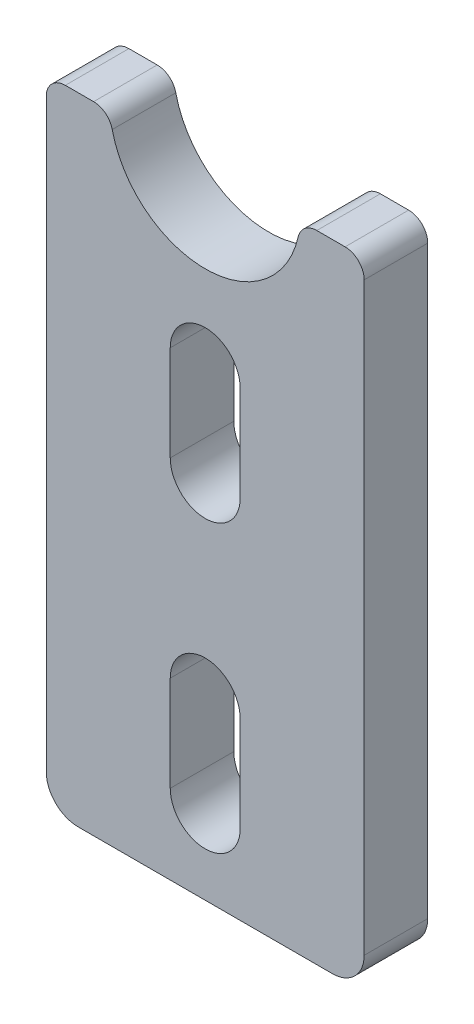
ISO-10303-21;
HEADER;
FILE_DESCRIPTION(('STEP AP214'),'2;1');
FILE_NAME('part.step','',(''),(''),'','','');
FILE_SCHEMA(('AUTOMOTIVE_DESIGN { 1 0 10303 214 1 1 1 1 }'));
ENDSEC;
DATA;
#1=APPLICATION_CONTEXT('core data for automotive mechanical design processes');
#2=APPLICATION_PROTOCOL_DEFINITION('international standard','automotive_design',2000,#1);
#3=PRODUCT_CONTEXT('',#1,'mechanical');
#4=PRODUCT('Part','Part','',(#3));
#5=PRODUCT_RELATED_PRODUCT_CATEGORY('part','',(#4));
#6=PRODUCT_DEFINITION_FORMATION('','',#4);
#7=PRODUCT_DEFINITION_CONTEXT('part definition',#1,'design');
#8=PRODUCT_DEFINITION('design','',#6,#7);
#9=PRODUCT_DEFINITION_SHAPE('','',#8);
#10=(LENGTH_UNIT() NAMED_UNIT(*) SI_UNIT(.MILLI.,.METRE.));
#11=(NAMED_UNIT(*) PLANE_ANGLE_UNIT() SI_UNIT($,.RADIAN.));
#12=(NAMED_UNIT(*) SI_UNIT($,.STERADIAN.) SOLID_ANGLE_UNIT());
#13=UNCERTAINTY_MEASURE_WITH_UNIT(LENGTH_MEASURE(1.E-05),#10,'distance_accuracy_value','');
#14=(GEOMETRIC_REPRESENTATION_CONTEXT(3) GLOBAL_UNCERTAINTY_ASSIGNED_CONTEXT((#13)) GLOBAL_UNIT_ASSIGNED_CONTEXT((#10,
#11,#12)) REPRESENTATION_CONTEXT('',''));
#15=CARTESIAN_POINT('',(0.,0.,0.));
#16=DIRECTION('',(0.,0.,1.));
#17=DIRECTION('',(1.,0.,0.));
#18=AXIS2_PLACEMENT_3D('',#15,#16,#17);
#19=CARTESIAN_POINT('',(-25.,50.,-10.));
#20=DIRECTION('',(0.,1.,0.));
#21=DIRECTION('',(0.,0.,1.));
#22=AXIS2_PLACEMENT_3D('',#19,#20,#21);
#23=PLANE('',#22);
#24=DIRECTION('',(-1.,0.,0.));
#25=VECTOR('',#24,1.);
#26=CARTESIAN_POINT('',(-25.,50.,0.));
#27=LINE('',#26,#25);
#28=CARTESIAN_POINT('',(-17.5499287747842,50.,0.));
#29=VERTEX_POINT('',#28);
#30=CARTESIAN_POINT('',(-22.,50.,0.));
#31=VERTEX_POINT('',#30);
#32=EDGE_CURVE('E269',#29,#31,#27,.T.);
#33=ORIENTED_EDGE('',*,*,#32,.F.);
#34=DIRECTION('',(0.,0.,-1.));
#35=VECTOR('',#34,1.);
#36=CARTESIAN_POINT('',(-17.5499287747842,50.,-10.));
#37=LINE('',#36,#35);
#38=CARTESIAN_POINT('',(-17.5499287747842,50.,-10.));
#39=VERTEX_POINT('',#38);
#40=EDGE_CURVE('E46',#29,#39,#37,.T.);
#41=ORIENTED_EDGE('',*,*,#40,.T.);
#42=DIRECTION('',(-1.,0.,0.));
#43=VECTOR('',#42,1.);
#44=CARTESIAN_POINT('',(-25.,50.,-10.));
#45=LINE('',#44,#43);
#46=CARTESIAN_POINT('',(-22.,50.,-10.));
#47=VERTEX_POINT('',#46);
#48=EDGE_CURVE('E256',#39,#47,#45,.T.);
#49=ORIENTED_EDGE('',*,*,#48,.T.);
#50=DIRECTION('',(0.,0.,1.));
#51=VECTOR('',#50,1.);
#52=CARTESIAN_POINT('',(-22.,50.,-10.));
#53=LINE('',#52,#51);
#54=EDGE_CURVE('E322',#47,#31,#53,.T.);
#55=ORIENTED_EDGE('',*,*,#54,.T.);
#56=EDGE_LOOP('',(#33,#41,#49,#55));
#57=FACE_BOUND('',#56,.T.);
#58=ADVANCED_FACE('F38',(#57),#23,.T.);
#59=CARTESIAN_POINT('',(25.,50.,-10.));
#60=DIRECTION('',(1.,0.,0.));
#61=DIRECTION('',(0.,1.,0.));
#62=AXIS2_PLACEMENT_3D('',#59,#60,#61);
#63=PLANE('',#62);
#64=DIRECTION('',(0.,1.,0.));
#65=VECTOR('',#64,1.);
#66=CARTESIAN_POINT('',(25.,50.,-10.));
#67=LINE('',#66,#65);
#68=CARTESIAN_POINT('',(25.,-45.,-10.));
#69=VERTEX_POINT('',#68);
#70=CARTESIAN_POINT('',(25.,47.,-10.));
#71=VERTEX_POINT('',#70);
#72=EDGE_CURVE('E253',#69,#71,#67,.T.);
#73=ORIENTED_EDGE('',*,*,#72,.T.);
#74=DIRECTION('',(0.,0.,1.));
#75=VECTOR('',#74,1.);
#76=CARTESIAN_POINT('',(25.,47.,-10.));
#77=LINE('',#76,#75);
#78=CARTESIAN_POINT('',(25.,47.,0.));
#79=VERTEX_POINT('',#78);
#80=EDGE_CURVE('E295',#71,#79,#77,.T.);
#81=ORIENTED_EDGE('',*,*,#80,.T.);
#82=DIRECTION('',(0.,1.,0.));
#83=VECTOR('',#82,1.);
#84=CARTESIAN_POINT('',(25.,50.,0.));
#85=LINE('',#84,#83);
#86=CARTESIAN_POINT('',(25.,-45.,0.));
#87=VERTEX_POINT('',#86);
#88=EDGE_CURVE('E252',#87,#79,#85,.T.);
#89=ORIENTED_EDGE('',*,*,#88,.F.);
#90=DIRECTION('',(0.,0.,1.));
#91=VECTOR('',#90,1.);
#92=CARTESIAN_POINT('',(25.,-45.,-10.));
#93=LINE('',#92,#91);
#94=EDGE_CURVE('E285',#87,#69,#93,.F.);
#95=ORIENTED_EDGE('',*,*,#94,.T.);
#96=EDGE_LOOP('',(#73,#81,#89,#95));
#97=FACE_BOUND('',#96,.T.);
#98=ADVANCED_FACE('F385',(#97),#63,.T.);
#99=CARTESIAN_POINT('',(-25.,-50.,-10.));
#100=DIRECTION('',(0.,-1.,0.));
#101=DIRECTION('',(0.,0.,-1.));
#102=AXIS2_PLACEMENT_3D('',#99,#100,#101);
#103=PLANE('',#102);
#104=DIRECTION('',(1.,0.,0.));
#105=VECTOR('',#104,1.);
#106=CARTESIAN_POINT('',(-25.,-50.,-10.));
#107=LINE('',#106,#105);
#108=CARTESIAN_POINT('',(-20.,-50.,-10.));
#109=VERTEX_POINT('',#108);
#110=CARTESIAN_POINT('',(20.,-50.,-10.));
#111=VERTEX_POINT('',#110);
#112=EDGE_CURVE('E263',#109,#111,#107,.T.);
#113=ORIENTED_EDGE('',*,*,#112,.T.);
#114=DIRECTION('',(0.,0.,1.));
#115=VECTOR('',#114,1.);
#116=CARTESIAN_POINT('',(20.,-50.,-10.));
#117=LINE('',#116,#115);
#118=CARTESIAN_POINT('',(20.,-50.,0.));
#119=VERTEX_POINT('',#118);
#120=EDGE_CURVE('E278',#111,#119,#117,.T.);
#121=ORIENTED_EDGE('',*,*,#120,.T.);
#122=DIRECTION('',(1.,0.,0.));
#123=VECTOR('',#122,1.);
#124=CARTESIAN_POINT('',(-25.,-50.,0.));
#125=LINE('',#124,#123);
#126=CARTESIAN_POINT('',(-20.,-50.,0.));
#127=VERTEX_POINT('',#126);
#128=EDGE_CURVE('E257',#127,#119,#125,.T.);
#129=ORIENTED_EDGE('',*,*,#128,.F.);
#130=DIRECTION('',(0.,0.,1.));
#131=VECTOR('',#130,1.);
#132=CARTESIAN_POINT('',(-20.,-50.,-10.));
#133=LINE('',#132,#131);
#134=EDGE_CURVE('E266',#127,#109,#133,.F.);
#135=ORIENTED_EDGE('',*,*,#134,.T.);
#136=EDGE_LOOP('',(#113,#121,#129,#135));
#137=FACE_BOUND('',#136,.T.);
#138=ADVANCED_FACE('F390',(#137),#103,.T.);
#139=CARTESIAN_POINT('',(-25.,50.,-10.));
#140=DIRECTION('',(-1.,0.,0.));
#141=DIRECTION('',(0.,-1.,0.));
#142=AXIS2_PLACEMENT_3D('',#139,#140,#141);
#143=PLANE('',#142);
#144=DIRECTION('',(0.,-1.,0.));
#145=VECTOR('',#144,1.);
#146=CARTESIAN_POINT('',(-25.,50.,0.));
#147=LINE('',#146,#145);
#148=CARTESIAN_POINT('',(-25.,47.,0.));
#149=VERTEX_POINT('',#148);
#150=CARTESIAN_POINT('',(-25.,-45.,0.));
#151=VERTEX_POINT('',#150);
#152=EDGE_CURVE('E273',#149,#151,#147,.T.);
#153=ORIENTED_EDGE('',*,*,#152,.F.);
#154=DIRECTION('',(0.,0.,1.));
#155=VECTOR('',#154,1.);
#156=CARTESIAN_POINT('',(-25.,47.,-10.));
#157=LINE('',#156,#155);
#158=CARTESIAN_POINT('',(-25.,47.,-10.));
#159=VERTEX_POINT('',#158);
#160=EDGE_CURVE('E11',#149,#159,#157,.F.);
#161=ORIENTED_EDGE('',*,*,#160,.T.);
#162=DIRECTION('',(0.,-1.,0.));
#163=VECTOR('',#162,1.);
#164=CARTESIAN_POINT('',(-25.,50.,-10.));
#165=LINE('',#164,#163);
#166=CARTESIAN_POINT('',(-25.,-45.,-10.));
#167=VERTEX_POINT('',#166);
#168=EDGE_CURVE('E261',#159,#167,#165,.T.);
#169=ORIENTED_EDGE('',*,*,#168,.T.);
#170=DIRECTION('',(0.,0.,1.));
#171=VECTOR('',#170,1.);
#172=CARTESIAN_POINT('',(-25.,-45.,-10.));
#173=LINE('',#172,#171);
#174=EDGE_CURVE('E292',#167,#151,#173,.T.);
#175=ORIENTED_EDGE('',*,*,#174,.T.);
#176=EDGE_LOOP('',(#153,#161,#169,#175));
#177=FACE_BOUND('',#176,.T.);
#178=ADVANCED_FACE('F395',(#177),#143,.T.);
#179=CARTESIAN_POINT('',(22.,50.,0.));
#180=VERTEX_POINT('',#179);
#181=CARTESIAN_POINT('',(17.5499287747842,50.,0.));
#182=VERTEX_POINT('',#181);
#183=EDGE_CURVE('E270',#180,#182,#27,.T.);
#184=ORIENTED_EDGE('',*,*,#183,.F.);
#185=DIRECTION('',(0.,0.,1.));
#186=VECTOR('',#185,1.);
#187=CARTESIAN_POINT('',(22.,50.,-10.));
#188=LINE('',#187,#186);
#189=CARTESIAN_POINT('',(22.,50.,-10.));
#190=VERTEX_POINT('',#189);
#191=EDGE_CURVE('E308',#180,#190,#188,.F.);
#192=ORIENTED_EDGE('',*,*,#191,.T.);
#193=CARTESIAN_POINT('',(17.5499287747842,50.,-10.));
#194=VERTEX_POINT('',#193);
#195=EDGE_CURVE('E260',#190,#194,#45,.T.);
#196=ORIENTED_EDGE('',*,*,#195,.T.);
#197=DIRECTION('',(0.,0.,-1.));
#198=VECTOR('',#197,1.);
#199=CARTESIAN_POINT('',(17.5499287747842,50.,0.));
#200=LINE('',#199,#198);
#201=EDGE_CURVE('E306',#194,#182,#200,.F.);
#202=ORIENTED_EDGE('',*,*,#201,.T.);
#203=EDGE_LOOP('',(#184,#192,#196,#202));
#204=FACE_BOUND('',#203,.T.);
#205=ADVANCED_FACE('F357',(#204),#23,.T.);
#206=CARTESIAN_POINT('',(0.,0.,-10.));
#207=DIRECTION('',(0.,0.,1.));
#208=DIRECTION('',(1.,0.,0.));
#209=AXIS2_PLACEMENT_3D('',#206,#207,#208);
#210=PLANE('',#209);
#211=DIRECTION('',(0.,1.,0.));
#212=VECTOR('',#211,1.);
#213=CARTESIAN_POINT('',(5.5,0.,-10.));
#214=LINE('',#213,#212);
#215=CARTESIAN_POINT('',(5.5,7.5,-10.));
#216=VERTEX_POINT('',#215);
#217=CARTESIAN_POINT('',(5.5,22.5,-10.));
#218=VERTEX_POINT('',#217);
#219=EDGE_CURVE('E246',#216,#218,#214,.T.);
#220=ORIENTED_EDGE('',*,*,#219,.T.);
#221=CARTESIAN_POINT('',(0.,22.5,-10.));
#222=DIRECTION('',(0.,0.,1.));
#223=DIRECTION('',(1.,0.,0.));
#224=AXIS2_PLACEMENT_3D('',#221,#222,#223);
#225=CIRCLE('',#224,5.5);
#226=CARTESIAN_POINT('',(-5.5,22.5,-10.));
#227=VERTEX_POINT('',#226);
#228=EDGE_CURVE('E249',#218,#227,#225,.T.);
#229=ORIENTED_EDGE('',*,*,#228,.T.);
#230=DIRECTION('',(0.,-1.,0.));
#231=VECTOR('',#230,1.);
#232=CARTESIAN_POINT('',(-5.49999999999999,0.,-10.));
#233=LINE('',#232,#231);
#234=CARTESIAN_POINT('',(-5.49999999999999,7.5,-10.));
#235=VERTEX_POINT('',#234);
#236=EDGE_CURVE('E243',#227,#235,#233,.T.);
#237=ORIENTED_EDGE('',*,*,#236,.T.);
#238=CARTESIAN_POINT('',(0.,7.5,-10.));
#239=DIRECTION('',(0.,0.,1.));
#240=DIRECTION('',(1.,0.,0.));
#241=AXIS2_PLACEMENT_3D('',#238,#239,#240);
#242=CIRCLE('',#241,5.5);
#243=EDGE_CURVE('E183',#235,#216,#242,.T.);
#244=ORIENTED_EDGE('',*,*,#243,.T.);
#245=EDGE_LOOP('',(#220,#229,#237,#244));
#246=FACE_BOUND('',#245,.T.);
#247=DIRECTION('',(0.,-1.,0.));
#248=VECTOR('',#247,1.);
#249=CARTESIAN_POINT('',(-5.50000000000001,0.,-10.));
#250=LINE('',#249,#248);
#251=CARTESIAN_POINT('',(-5.5,-22.5,-10.));
#252=VERTEX_POINT('',#251);
#253=CARTESIAN_POINT('',(-5.5,-37.5,-10.));
#254=VERTEX_POINT('',#253);
#255=EDGE_CURVE('E237',#252,#254,#250,.T.);
#256=ORIENTED_EDGE('',*,*,#255,.T.);
#257=CARTESIAN_POINT('',(0.,-37.5,-10.));
#258=DIRECTION('',(0.,0.,1.));
#259=DIRECTION('',(1.,0.,0.));
#260=AXIS2_PLACEMENT_3D('',#257,#258,#259);
#261=CIRCLE('',#260,5.5);
#262=CARTESIAN_POINT('',(5.5,-37.5,-10.));
#263=VERTEX_POINT('',#262);
#264=EDGE_CURVE('E240',#254,#263,#261,.T.);
#265=ORIENTED_EDGE('',*,*,#264,.T.);
#266=DIRECTION('',(0.,1.,0.));
#267=VECTOR('',#266,1.);
#268=CARTESIAN_POINT('',(5.49999999999999,0.,-10.));
#269=LINE('',#268,#267);
#270=CARTESIAN_POINT('',(5.5,-22.5,-10.));
#271=VERTEX_POINT('',#270);
#272=EDGE_CURVE('E208',#263,#271,#269,.T.);
#273=ORIENTED_EDGE('',*,*,#272,.T.);
#274=CARTESIAN_POINT('',(0.,-22.5,-10.));
#275=DIRECTION('',(0.,0.,1.));
#276=DIRECTION('',(1.,0.,0.));
#277=AXIS2_PLACEMENT_3D('',#274,#275,#276);
#278=CIRCLE('',#277,5.5);
#279=EDGE_CURVE('E234',#271,#252,#278,.T.);
#280=ORIENTED_EDGE('',*,*,#279,.T.);
#281=EDGE_LOOP('',(#256,#265,#273,#280));
#282=FACE_BOUND('',#281,.T.);
#283=ORIENTED_EDGE('',*,*,#195,.F.);
#284=CARTESIAN_POINT('',(22.,47.,-10.));
#285=DIRECTION('',(0.,0.,1.));
#286=DIRECTION('',(1.,0.,0.));
#287=AXIS2_PLACEMENT_3D('',#284,#285,#286);
#288=CIRCLE('',#287,3.);
#289=EDGE_CURVE('E315',#190,#71,#288,.F.);
#290=ORIENTED_EDGE('',*,*,#289,.T.);
#291=ORIENTED_EDGE('',*,*,#72,.F.);
#292=CARTESIAN_POINT('',(20.,-45.,-10.));
#293=DIRECTION('',(0.,0.,1.));
#294=DIRECTION('',(1.,0.,0.));
#295=AXIS2_PLACEMENT_3D('',#292,#293,#294);
#296=CIRCLE('',#295,5.);
#297=EDGE_CURVE('E290',#69,#111,#296,.F.);
#298=ORIENTED_EDGE('',*,*,#297,.T.);
#299=ORIENTED_EDGE('',*,*,#112,.F.);
#300=CARTESIAN_POINT('',(-20.,-45.,-10.));
#301=DIRECTION('',(0.,0.,1.));
#302=DIRECTION('',(1.,0.,0.));
#303=AXIS2_PLACEMENT_3D('',#300,#301,#302);
#304=CIRCLE('',#303,5.);
#305=EDGE_CURVE('E287',#109,#167,#304,.F.);
#306=ORIENTED_EDGE('',*,*,#305,.T.);
#307=ORIENTED_EDGE('',*,*,#168,.F.);
#308=CARTESIAN_POINT('',(-22.,47.,-10.));
#309=DIRECTION('',(0.,0.,1.));
#310=DIRECTION('',(1.,0.,0.));
#311=AXIS2_PLACEMENT_3D('',#308,#309,#310);
#312=CIRCLE('',#311,3.);
#313=EDGE_CURVE('E310',#159,#47,#312,.F.);
#314=ORIENTED_EDGE('',*,*,#313,.T.);
#315=ORIENTED_EDGE('',*,*,#48,.F.);
#316=CARTESIAN_POINT('',(-17.5499287747842,47.,-10.));
#317=DIRECTION('',(0.,0.,1.));
#318=DIRECTION('',(1.,0.,0.));
#319=AXIS2_PLACEMENT_3D('',#316,#317,#318);
#320=CIRCLE('',#319,3.);
#321=CARTESIAN_POINT('',(-14.6249406456535,47.6666666666667,-10.));
#322=VERTEX_POINT('',#321);
#323=EDGE_CURVE('E312',#39,#322,#320,.F.);
#324=ORIENTED_EDGE('',*,*,#323,.T.);
#325=CARTESIAN_POINT('',(0.,51.,-10.));
#326=DIRECTION('',(0.,0.,1.));
#327=DIRECTION('',(1.,0.,0.));
#328=AXIS2_PLACEMENT_3D('',#325,#326,#327);
#329=CIRCLE('',#328,15.);
#330=CARTESIAN_POINT('',(14.6249406456535,47.6666666666667,-10.));
#331=VERTEX_POINT('',#330);
#332=EDGE_CURVE('E214',#322,#331,#329,.T.);
#333=ORIENTED_EDGE('',*,*,#332,.T.);
#334=CARTESIAN_POINT('',(17.5499287747842,47.,-10.));
#335=DIRECTION('',(0.,0.,1.));
#336=DIRECTION('',(1.,0.,0.));
#337=AXIS2_PLACEMENT_3D('',#334,#335,#336);
#338=CIRCLE('',#337,3.);
#339=EDGE_CURVE('E59',#331,#194,#338,.F.);
#340=ORIENTED_EDGE('',*,*,#339,.T.);
#341=EDGE_LOOP('',(#283,#290,#291,#298,#299,#306,#307,#314,#315,#324,#333,#340));
#342=FACE_BOUND('',#341,.T.);
#343=ADVANCED_FACE('F334',(#246,#282,#342),#210,.F.);
#344=CARTESIAN_POINT('',(0.,0.,0.));
#345=DIRECTION('',(0.,0.,1.));
#346=DIRECTION('',(1.,0.,0.));
#347=AXIS2_PLACEMENT_3D('',#344,#345,#346);
#348=PLANE('',#347);
#349=ORIENTED_EDGE('',*,*,#88,.T.);
#350=CARTESIAN_POINT('',(22.,47.,0.));
#351=DIRECTION('',(0.,0.,1.));
#352=DIRECTION('',(1.,0.,0.));
#353=AXIS2_PLACEMENT_3D('',#350,#351,#352);
#354=CIRCLE('',#353,3.);
#355=EDGE_CURVE('E304',#79,#180,#354,.T.);
#356=ORIENTED_EDGE('',*,*,#355,.T.);
#357=ORIENTED_EDGE('',*,*,#183,.T.);
#358=CARTESIAN_POINT('',(17.5499287747842,47.,0.));
#359=DIRECTION('',(0.,0.,1.));
#360=DIRECTION('',(1.,0.,0.));
#361=AXIS2_PLACEMENT_3D('',#358,#359,#360);
#362=CIRCLE('',#361,3.);
#363=CARTESIAN_POINT('',(14.6249406456535,47.6666666666667,0.));
#364=VERTEX_POINT('',#363);
#365=EDGE_CURVE('E302',#182,#364,#362,.T.);
#366=ORIENTED_EDGE('',*,*,#365,.T.);
#367=CARTESIAN_POINT('',(0.,51.,0.));
#368=DIRECTION('',(0.,0.,1.));
#369=DIRECTION('',(1.,0.,0.));
#370=AXIS2_PLACEMENT_3D('',#367,#368,#369);
#371=CIRCLE('',#370,15.);
#372=CARTESIAN_POINT('',(-14.6249406456535,47.6666666666667,0.));
#373=VERTEX_POINT('',#372);
#374=EDGE_CURVE('E344',#373,#364,#371,.T.);
#375=ORIENTED_EDGE('',*,*,#374,.F.);
#376=CARTESIAN_POINT('',(-17.5499287747842,47.,0.));
#377=DIRECTION('',(0.,0.,1.));
#378=DIRECTION('',(1.,0.,0.));
#379=AXIS2_PLACEMENT_3D('',#376,#377,#378);
#380=CIRCLE('',#379,3.);
#381=EDGE_CURVE('E300',#373,#29,#380,.T.);
#382=ORIENTED_EDGE('',*,*,#381,.T.);
#383=ORIENTED_EDGE('',*,*,#32,.T.);
#384=CARTESIAN_POINT('',(-22.,47.,0.));
#385=DIRECTION('',(0.,0.,1.));
#386=DIRECTION('',(1.,0.,0.));
#387=AXIS2_PLACEMENT_3D('',#384,#385,#386);
#388=CIRCLE('',#387,3.);
#389=EDGE_CURVE('E298',#31,#149,#388,.T.);
#390=ORIENTED_EDGE('',*,*,#389,.T.);
#391=ORIENTED_EDGE('',*,*,#152,.T.);
#392=CARTESIAN_POINT('',(-20.,-45.,0.));
#393=DIRECTION('',(0.,0.,1.));
#394=DIRECTION('',(1.,0.,0.));
#395=AXIS2_PLACEMENT_3D('',#392,#393,#394);
#396=CIRCLE('',#395,5.);
#397=EDGE_CURVE('E281',#151,#127,#396,.T.);
#398=ORIENTED_EDGE('',*,*,#397,.T.);
#399=ORIENTED_EDGE('',*,*,#128,.T.);
#400=CARTESIAN_POINT('',(20.,-45.,0.));
#401=DIRECTION('',(0.,0.,1.));
#402=DIRECTION('',(1.,0.,0.));
#403=AXIS2_PLACEMENT_3D('',#400,#401,#402);
#404=CIRCLE('',#403,5.);
#405=EDGE_CURVE('E283',#119,#87,#404,.T.);
#406=ORIENTED_EDGE('',*,*,#405,.T.);
#407=EDGE_LOOP('',(#349,#356,#357,#366,#375,#382,#383,#390,#391,#398,#399,#406));
#408=FACE_BOUND('',#407,.T.);
#409=CARTESIAN_POINT('',(0.,22.5,0.));
#410=DIRECTION('',(0.,0.,1.));
#411=DIRECTION('',(1.,0.,0.));
#412=AXIS2_PLACEMENT_3D('',#409,#410,#411);
#413=CIRCLE('',#412,5.5);
#414=CARTESIAN_POINT('',(5.5,22.5,0.));
#415=VERTEX_POINT('',#414);
#416=CARTESIAN_POINT('',(-5.5,22.5,0.));
#417=VERTEX_POINT('',#416);
#418=EDGE_CURVE('E196',#415,#417,#413,.T.);
#419=ORIENTED_EDGE('',*,*,#418,.F.);
#420=DIRECTION('',(0.,1.,0.));
#421=VECTOR('',#420,1.);
#422=CARTESIAN_POINT('',(5.5,22.5,0.));
#423=LINE('',#422,#421);
#424=CARTESIAN_POINT('',(5.5,7.5,0.));
#425=VERTEX_POINT('',#424);
#426=EDGE_CURVE('E201',#425,#415,#423,.T.);
#427=ORIENTED_EDGE('',*,*,#426,.F.);
#428=CARTESIAN_POINT('',(0.,7.5,0.));
#429=DIRECTION('',(0.,0.,1.));
#430=DIRECTION('',(1.,0.,0.));
#431=AXIS2_PLACEMENT_3D('',#428,#429,#430);
#432=CIRCLE('',#431,5.5);
#433=CARTESIAN_POINT('',(-5.5,7.5,0.));
#434=VERTEX_POINT('',#433);
#435=EDGE_CURVE('E180',#434,#425,#432,.T.);
#436=ORIENTED_EDGE('',*,*,#435,.F.);
#437=DIRECTION('',(0.,-1.,0.));
#438=VECTOR('',#437,1.);
#439=CARTESIAN_POINT('',(-5.5,22.5,0.));
#440=LINE('',#439,#438);
#441=EDGE_CURVE('E191',#417,#434,#440,.T.);
#442=ORIENTED_EDGE('',*,*,#441,.F.);
#443=EDGE_LOOP('',(#419,#427,#436,#442));
#444=FACE_BOUND('',#443,.T.);
#445=CARTESIAN_POINT('',(0.,-37.5,0.));
#446=DIRECTION('',(0.,0.,1.));
#447=DIRECTION('',(1.,0.,0.));
#448=AXIS2_PLACEMENT_3D('',#445,#446,#447);
#449=CIRCLE('',#448,5.5);
#450=CARTESIAN_POINT('',(-5.5,-37.5,0.));
#451=VERTEX_POINT('',#450);
#452=CARTESIAN_POINT('',(5.5,-37.5,0.));
#453=VERTEX_POINT('',#452);
#454=EDGE_CURVE('E211',#451,#453,#449,.T.);
#455=ORIENTED_EDGE('',*,*,#454,.F.);
#456=DIRECTION('',(0.,-1.,0.));
#457=VECTOR('',#456,1.);
#458=CARTESIAN_POINT('',(-5.5,-37.5,0.));
#459=LINE('',#458,#457);
#460=CARTESIAN_POINT('',(-5.5,-22.5,0.));
#461=VERTEX_POINT('',#460);
#462=EDGE_CURVE('E220',#461,#451,#459,.T.);
#463=ORIENTED_EDGE('',*,*,#462,.F.);
#464=CARTESIAN_POINT('',(0.,-22.5,0.));
#465=DIRECTION('',(0.,0.,1.));
#466=DIRECTION('',(1.,0.,0.));
#467=AXIS2_PLACEMENT_3D('',#464,#465,#466);
#468=CIRCLE('',#467,5.5);
#469=CARTESIAN_POINT('',(5.5,-22.5,0.));
#470=VERTEX_POINT('',#469);
#471=EDGE_CURVE('E217',#470,#461,#468,.T.);
#472=ORIENTED_EDGE('',*,*,#471,.F.);
#473=DIRECTION('',(0.,1.,0.));
#474=VECTOR('',#473,1.);
#475=CARTESIAN_POINT('',(5.5,-37.5,0.));
#476=LINE('',#475,#474);
#477=EDGE_CURVE('E213',#453,#470,#476,.T.);
#478=ORIENTED_EDGE('',*,*,#477,.F.);
#479=EDGE_LOOP('',(#455,#463,#472,#478));
#480=FACE_BOUND('',#479,.T.);
#481=ADVANCED_FACE('F198',(#408,#444,#480),#348,.T.);
#482=CARTESIAN_POINT('',(0.,-37.5,-20.));
#483=DIRECTION('',(0.,0.,1.));
#484=DIRECTION('',(1.,0.,0.));
#485=AXIS2_PLACEMENT_3D('',#482,#483,#484);
#486=CYLINDRICAL_SURFACE('',#485,5.5);
#487=DIRECTION('',(0.,0.,1.));
#488=VECTOR('',#487,1.);
#489=CARTESIAN_POINT('',(-5.5,-37.5,-20.));
#490=LINE('',#489,#488);
#491=EDGE_CURVE('E224',#254,#451,#490,.T.);
#492=ORIENTED_EDGE('',*,*,#491,.T.);
#493=ORIENTED_EDGE('',*,*,#454,.T.);
#494=DIRECTION('',(0.,0.,1.));
#495=VECTOR('',#494,1.);
#496=CARTESIAN_POINT('',(5.5,-37.5,-20.));
#497=LINE('',#496,#495);
#498=EDGE_CURVE('E223',#263,#453,#497,.T.);
#499=ORIENTED_EDGE('',*,*,#498,.F.);
#500=ORIENTED_EDGE('',*,*,#264,.F.);
#501=EDGE_LOOP('',(#492,#493,#499,#500));
#502=FACE_BOUND('',#501,.T.);
#503=ADVANCED_FACE('F372',(#502),#486,.F.);
#504=CARTESIAN_POINT('',(-5.5,-37.5,-20.));
#505=DIRECTION('',(-1.,0.,0.));
#506=DIRECTION('',(0.,-1.,0.));
#507=AXIS2_PLACEMENT_3D('',#504,#505,#506);
#508=PLANE('',#507);
#509=DIRECTION('',(0.,0.,1.));
#510=VECTOR('',#509,1.);
#511=CARTESIAN_POINT('',(-5.5,-22.5,-20.));
#512=LINE('',#511,#510);
#513=EDGE_CURVE('E226',#252,#461,#512,.T.);
#514=ORIENTED_EDGE('',*,*,#513,.T.);
#515=ORIENTED_EDGE('',*,*,#462,.T.);
#516=ORIENTED_EDGE('',*,*,#491,.F.);
#517=ORIENTED_EDGE('',*,*,#255,.F.);
#518=EDGE_LOOP('',(#514,#515,#516,#517));
#519=FACE_BOUND('',#518,.T.);
#520=ADVANCED_FACE('F363',(#519),#508,.F.);
#521=CARTESIAN_POINT('',(0.,-22.5,-20.));
#522=DIRECTION('',(0.,0.,1.));
#523=DIRECTION('',(1.,0.,0.));
#524=AXIS2_PLACEMENT_3D('',#521,#522,#523);
#525=CYLINDRICAL_SURFACE('',#524,5.5);
#526=DIRECTION('',(0.,0.,1.));
#527=VECTOR('',#526,1.);
#528=CARTESIAN_POINT('',(5.5,-22.5,-20.));
#529=LINE('',#528,#527);
#530=EDGE_CURVE('E228',#271,#470,#529,.T.);
#531=ORIENTED_EDGE('',*,*,#530,.T.);
#532=ORIENTED_EDGE('',*,*,#471,.T.);
#533=ORIENTED_EDGE('',*,*,#513,.F.);
#534=ORIENTED_EDGE('',*,*,#279,.F.);
#535=EDGE_LOOP('',(#531,#532,#533,#534));
#536=FACE_BOUND('',#535,.T.);
#537=ADVANCED_FACE('F365',(#536),#525,.F.);
#538=CARTESIAN_POINT('',(5.5,-37.5,-20.));
#539=DIRECTION('',(1.,0.,0.));
#540=DIRECTION('',(0.,1.,0.));
#541=AXIS2_PLACEMENT_3D('',#538,#539,#540);
#542=PLANE('',#541);
#543=ORIENTED_EDGE('',*,*,#498,.T.);
#544=ORIENTED_EDGE('',*,*,#477,.T.);
#545=ORIENTED_EDGE('',*,*,#530,.F.);
#546=ORIENTED_EDGE('',*,*,#272,.F.);
#547=EDGE_LOOP('',(#543,#544,#545,#546));
#548=FACE_BOUND('',#547,.T.);
#549=ADVANCED_FACE('F374',(#548),#542,.F.);
#550=CARTESIAN_POINT('',(0.,22.5,-20.));
#551=DIRECTION('',(0.,0.,1.));
#552=DIRECTION('',(1.,0.,0.));
#553=AXIS2_PLACEMENT_3D('',#550,#551,#552);
#554=CYLINDRICAL_SURFACE('',#553,5.5);
#555=DIRECTION('',(0.,0.,1.));
#556=VECTOR('',#555,1.);
#557=CARTESIAN_POINT('',(5.5,22.5,-20.));
#558=LINE('',#557,#556);
#559=EDGE_CURVE('E206',#218,#415,#558,.T.);
#560=ORIENTED_EDGE('',*,*,#559,.T.);
#561=ORIENTED_EDGE('',*,*,#418,.T.);
#562=DIRECTION('',(0.,0.,1.));
#563=VECTOR('',#562,1.);
#564=CARTESIAN_POINT('',(-5.5,22.5,-20.));
#565=LINE('',#564,#563);
#566=EDGE_CURVE('E187',#227,#417,#565,.T.);
#567=ORIENTED_EDGE('',*,*,#566,.F.);
#568=ORIENTED_EDGE('',*,*,#228,.F.);
#569=EDGE_LOOP('',(#560,#561,#567,#568));
#570=FACE_BOUND('',#569,.T.);
#571=ADVANCED_FACE('F350',(#570),#554,.F.);
#572=CARTESIAN_POINT('',(5.5,22.5,-20.));
#573=DIRECTION('',(1.,0.,0.));
#574=DIRECTION('',(0.,1.,0.));
#575=AXIS2_PLACEMENT_3D('',#572,#573,#574);
#576=PLANE('',#575);
#577=DIRECTION('',(0.,0.,1.));
#578=VECTOR('',#577,1.);
#579=CARTESIAN_POINT('',(5.5,7.5,-20.));
#580=LINE('',#579,#578);
#581=EDGE_CURVE('E186',#216,#425,#580,.T.);
#582=ORIENTED_EDGE('',*,*,#581,.T.);
#583=ORIENTED_EDGE('',*,*,#426,.T.);
#584=ORIENTED_EDGE('',*,*,#559,.F.);
#585=ORIENTED_EDGE('',*,*,#219,.F.);
#586=EDGE_LOOP('',(#582,#583,#584,#585));
#587=FACE_BOUND('',#586,.T.);
#588=ADVANCED_FACE('F353',(#587),#576,.F.);
#589=CARTESIAN_POINT('',(0.,7.5,-20.));
#590=DIRECTION('',(0.,0.,1.));
#591=DIRECTION('',(1.,0.,0.));
#592=AXIS2_PLACEMENT_3D('',#589,#590,#591);
#593=CYLINDRICAL_SURFACE('',#592,5.5);
#594=DIRECTION('',(0.,0.,1.));
#595=VECTOR('',#594,1.);
#596=CARTESIAN_POINT('',(-5.5,7.5,-20.));
#597=LINE('',#596,#595);
#598=EDGE_CURVE('E175',#235,#434,#597,.T.);
#599=ORIENTED_EDGE('',*,*,#598,.T.);
#600=ORIENTED_EDGE('',*,*,#435,.T.);
#601=ORIENTED_EDGE('',*,*,#581,.F.);
#602=ORIENTED_EDGE('',*,*,#243,.F.);
#603=EDGE_LOOP('',(#599,#600,#601,#602));
#604=FACE_BOUND('',#603,.T.);
#605=ADVANCED_FACE('F177',(#604),#593,.F.);
#606=CARTESIAN_POINT('',(-5.5,22.5,-20.));
#607=DIRECTION('',(-1.,0.,0.));
#608=DIRECTION('',(0.,-1.,0.));
#609=AXIS2_PLACEMENT_3D('',#606,#607,#608);
#610=PLANE('',#609);
#611=ORIENTED_EDGE('',*,*,#566,.T.);
#612=ORIENTED_EDGE('',*,*,#441,.T.);
#613=ORIENTED_EDGE('',*,*,#598,.F.);
#614=ORIENTED_EDGE('',*,*,#236,.F.);
#615=EDGE_LOOP('',(#611,#612,#613,#614));
#616=FACE_BOUND('',#615,.T.);
#617=ADVANCED_FACE('F192',(#616),#610,.F.);
#618=CARTESIAN_POINT('',(20.,-45.,-10.));
#619=DIRECTION('',(0.,0.,1.));
#620=DIRECTION('',(1.,0.,0.));
#621=AXIS2_PLACEMENT_3D('',#618,#619,#620);
#622=CYLINDRICAL_SURFACE('',#621,5.);
#623=ORIENTED_EDGE('',*,*,#297,.F.);
#624=ORIENTED_EDGE('',*,*,#94,.F.);
#625=ORIENTED_EDGE('',*,*,#405,.F.);
#626=ORIENTED_EDGE('',*,*,#120,.F.);
#627=EDGE_LOOP('',(#623,#624,#625,#626));
#628=FACE_BOUND('',#627,.T.);
#629=ADVANCED_FACE('F412',(#628),#622,.T.);
#630=CARTESIAN_POINT('',(-20.,-45.,-10.));
#631=DIRECTION('',(0.,0.,1.));
#632=DIRECTION('',(1.,0.,0.));
#633=AXIS2_PLACEMENT_3D('',#630,#631,#632);
#634=CYLINDRICAL_SURFACE('',#633,5.);
#635=ORIENTED_EDGE('',*,*,#305,.F.);
#636=ORIENTED_EDGE('',*,*,#134,.F.);
#637=ORIENTED_EDGE('',*,*,#397,.F.);
#638=ORIENTED_EDGE('',*,*,#174,.F.);
#639=EDGE_LOOP('',(#635,#636,#637,#638));
#640=FACE_BOUND('',#639,.T.);
#641=ADVANCED_FACE('F421',(#640),#634,.T.);
#642=CARTESIAN_POINT('',(0.,51.,-10.));
#643=DIRECTION('',(0.,0.,1.));
#644=DIRECTION('',(1.,0.,0.));
#645=AXIS2_PLACEMENT_3D('',#642,#643,#644);
#646=CYLINDRICAL_SURFACE('',#645,15.);
#647=ORIENTED_EDGE('',*,*,#374,.T.);
#648=DIRECTION('',(0.,0.,1.));
#649=VECTOR('',#648,1.);
#650=CARTESIAN_POINT('',(14.6249406456535,47.6666666666667,-10.));
#651=LINE('',#650,#649);
#652=EDGE_CURVE('E320',#364,#331,#651,.F.);
#653=ORIENTED_EDGE('',*,*,#652,.T.);
#654=ORIENTED_EDGE('',*,*,#332,.F.);
#655=DIRECTION('',(0.,0.,1.));
#656=VECTOR('',#655,1.);
#657=CARTESIAN_POINT('',(-14.6249406456535,47.6666666666667,-10.));
#658=LINE('',#657,#656);
#659=EDGE_CURVE('E317',#322,#373,#658,.T.);
#660=ORIENTED_EDGE('',*,*,#659,.T.);
#661=EDGE_LOOP('',(#647,#653,#654,#660));
#662=FACE_BOUND('',#661,.T.);
#663=ADVANCED_FACE('F343',(#662),#646,.F.);
#664=CARTESIAN_POINT('',(22.,47.,-10.));
#665=DIRECTION('',(0.,0.,1.));
#666=DIRECTION('',(1.,0.,0.));
#667=AXIS2_PLACEMENT_3D('',#664,#665,#666);
#668=CYLINDRICAL_SURFACE('',#667,3.);
#669=ORIENTED_EDGE('',*,*,#289,.F.);
#670=ORIENTED_EDGE('',*,*,#191,.F.);
#671=ORIENTED_EDGE('',*,*,#355,.F.);
#672=ORIENTED_EDGE('',*,*,#80,.F.);
#673=EDGE_LOOP('',(#669,#670,#671,#672));
#674=FACE_BOUND('',#673,.T.);
#675=ADVANCED_FACE('F405',(#674),#668,.T.);
#676=CARTESIAN_POINT('',(17.5499287747842,47.,-10.));
#677=DIRECTION('',(0.,0.,1.));
#678=DIRECTION('',(1.,0.,0.));
#679=AXIS2_PLACEMENT_3D('',#676,#677,#678);
#680=CYLINDRICAL_SURFACE('',#679,3.);
#681=ORIENTED_EDGE('',*,*,#365,.F.);
#682=ORIENTED_EDGE('',*,*,#201,.F.);
#683=ORIENTED_EDGE('',*,*,#339,.F.);
#684=ORIENTED_EDGE('',*,*,#652,.F.);
#685=EDGE_LOOP('',(#681,#682,#683,#684));
#686=FACE_BOUND('',#685,.T.);
#687=ADVANCED_FACE('F428',(#686),#680,.T.);
#688=CARTESIAN_POINT('',(-17.5499287747842,47.,-10.));
#689=DIRECTION('',(0.,0.,1.));
#690=DIRECTION('',(1.,0.,0.));
#691=AXIS2_PLACEMENT_3D('',#688,#689,#690);
#692=CYLINDRICAL_SURFACE('',#691,3.);
#693=ORIENTED_EDGE('',*,*,#323,.F.);
#694=ORIENTED_EDGE('',*,*,#40,.F.);
#695=ORIENTED_EDGE('',*,*,#381,.F.);
#696=ORIENTED_EDGE('',*,*,#659,.F.);
#697=EDGE_LOOP('',(#693,#694,#695,#696));
#698=FACE_BOUND('',#697,.T.);
#699=ADVANCED_FACE('F339',(#698),#692,.T.);
#700=CARTESIAN_POINT('',(-22.,47.,-10.));
#701=DIRECTION('',(0.,0.,1.));
#702=DIRECTION('',(1.,0.,0.));
#703=AXIS2_PLACEMENT_3D('',#700,#701,#702);
#704=CYLINDRICAL_SURFACE('',#703,3.);
#705=ORIENTED_EDGE('',*,*,#313,.F.);
#706=ORIENTED_EDGE('',*,*,#160,.F.);
#707=ORIENTED_EDGE('',*,*,#389,.F.);
#708=ORIENTED_EDGE('',*,*,#54,.F.);
#709=EDGE_LOOP('',(#705,#706,#707,#708));
#710=FACE_BOUND('',#709,.T.);
#711=ADVANCED_FACE('F40',(#710),#704,.T.);
#712=CLOSED_SHELL('',(#58,#98,#138,#178,#205,#343,#481,#503,#520,#537,#549,#571,#588,#605,#617,
#629,#641,#663,#675,#687,#699,#711));
#713=MANIFOLD_SOLID_BREP('B2',#712);
#714=ADVANCED_BREP_SHAPE_REPRESENTATION('',(#18,#713),#14);
#715=SHAPE_DEFINITION_REPRESENTATION(#9,#714);
ENDSEC;
END-ISO-10303-21;
